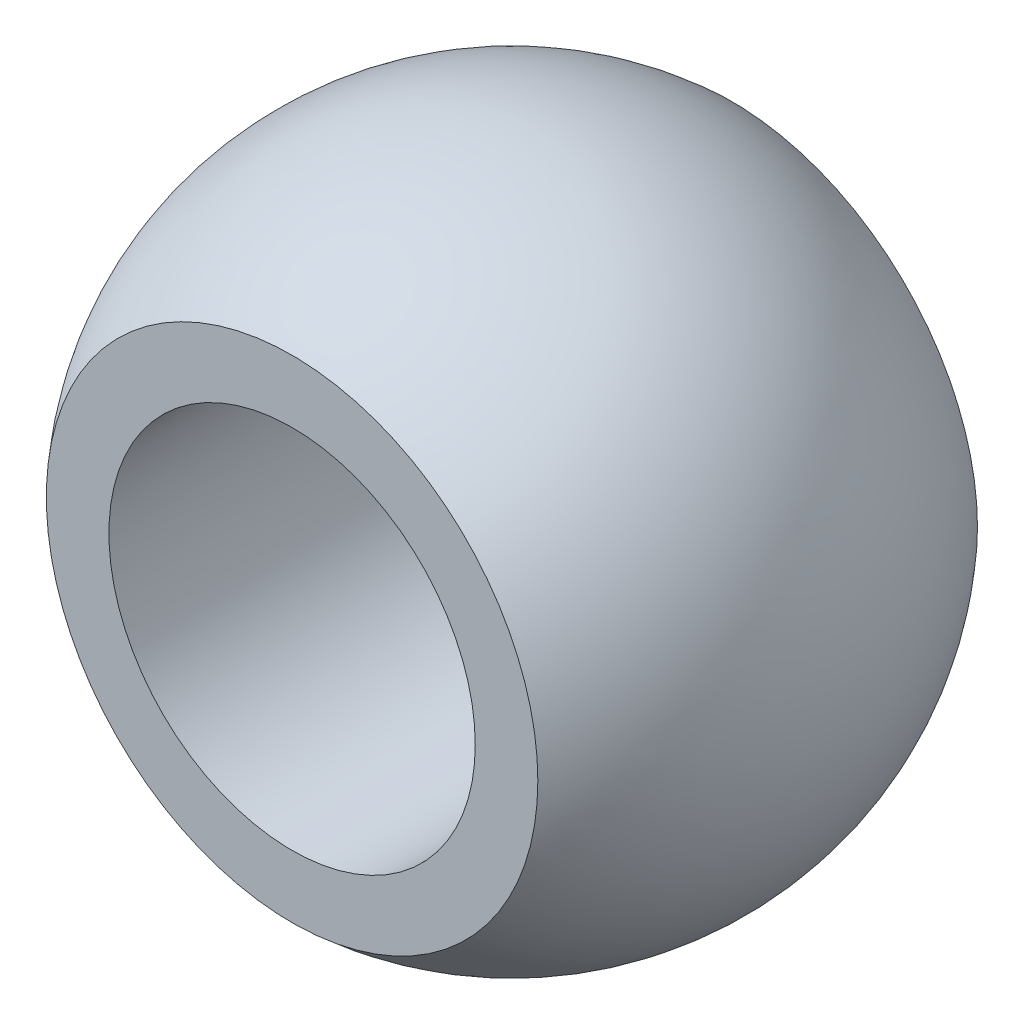
ISO-10303-21;
HEADER;
FILE_DESCRIPTION(('STEP AP214'),'2;1');
FILE_NAME('part.step','',(''),(''),'','','');
FILE_SCHEMA(('AUTOMOTIVE_DESIGN { 1 0 10303 214 1 1 1 1 }'));
ENDSEC;
DATA;
#1=APPLICATION_CONTEXT('core data for automotive mechanical design processes');
#2=APPLICATION_PROTOCOL_DEFINITION('international standard','automotive_design',2000,#1);
#3=PRODUCT_CONTEXT('',#1,'mechanical');
#4=PRODUCT('Part','Part','',(#3));
#5=PRODUCT_RELATED_PRODUCT_CATEGORY('part','',(#4));
#6=PRODUCT_DEFINITION_FORMATION('','',#4);
#7=PRODUCT_DEFINITION_CONTEXT('part definition',#1,'design');
#8=PRODUCT_DEFINITION('design','',#6,#7);
#9=PRODUCT_DEFINITION_SHAPE('','',#8);
#10=(LENGTH_UNIT() NAMED_UNIT(*) SI_UNIT(.MILLI.,.METRE.));
#11=(NAMED_UNIT(*) PLANE_ANGLE_UNIT() SI_UNIT($,.RADIAN.));
#12=(NAMED_UNIT(*) SI_UNIT($,.STERADIAN.) SOLID_ANGLE_UNIT());
#13=UNCERTAINTY_MEASURE_WITH_UNIT(LENGTH_MEASURE(1.E-05),#10,'distance_accuracy_value','');
#14=(GEOMETRIC_REPRESENTATION_CONTEXT(3) GLOBAL_UNCERTAINTY_ASSIGNED_CONTEXT((#13)) GLOBAL_UNIT_ASSIGNED_CONTEXT((#10,
#11,#12)) REPRESENTATION_CONTEXT('',''));
#15=CARTESIAN_POINT('',(0.,0.,0.));
#16=DIRECTION('',(0.,0.,1.));
#17=DIRECTION('',(1.,0.,0.));
#18=AXIS2_PLACEMENT_3D('',#15,#16,#17);
#19=CARTESIAN_POINT('',(0.,0.,0.));
#20=DIRECTION('',(0.,-1.,0.));
#21=DIRECTION('',(-1.,0.,0.));
#22=AXIS2_PLACEMENT_3D('',#19,#20,#21);
#23=SPHERICAL_SURFACE('',#22,14.2875);
#24=CARTESIAN_POINT('',(0.,0.,0.));
#25=DIRECTION('',(0.,0.,1.));
#26=DIRECTION('',(1.,0.,0.));
#27=AXIS2_PLACEMENT_3D('',#24,#25,#26);
#28=SPHERICAL_SURFACE('',#27,14.2875);
#29=CARTESIAN_POINT('',(0.,0.,9.525));
#30=DIRECTION('',(0.,0.,1.));
#31=DIRECTION('',(1.,0.,0.));
#32=AXIS2_PLACEMENT_3D('',#29,#30,#31);
#33=CIRCLE('',#32,10.6492737428427);
#34=CARTESIAN_POINT('',(10.6492737428427,0.,9.525));
#35=VERTEX_POINT('',#34);
#36=EDGE_CURVE('E10',#35,#35,#33,.T.);
#37=ORIENTED_EDGE('',*,*,#36,.F.);
#38=EDGE_LOOP('',(#37));
#39=FACE_BOUND('',#38,.T.);
#40=CARTESIAN_POINT('',(0.,0.,-9.525));
#41=DIRECTION('',(0.,0.,-1.));
#42=DIRECTION('',(-1.,0.,0.));
#43=AXIS2_PLACEMENT_3D('',#40,#41,#42);
#44=CIRCLE('',#43,10.6492737428427);
#45=CARTESIAN_POINT('',(-10.6492737428427,0.,-9.525));
#46=VERTEX_POINT('',#45);
#47=EDGE_CURVE('E38',#46,#46,#44,.T.);
#48=ORIENTED_EDGE('',*,*,#47,.F.);
#49=EDGE_LOOP('',(#48));
#50=FACE_BOUND('',#49,.T.);
#51=ADVANCED_FACE('F28',(#39,#50),#28,.T.);
#52=CARTESIAN_POINT('',(0.,0.,-25.4));
#53=DIRECTION('',(0.,0.,1.));
#54=DIRECTION('',(1.,0.,0.));
#55=AXIS2_PLACEMENT_3D('',#52,#53,#54);
#56=CYLINDRICAL_SURFACE('',#55,7.9375);
#57=CARTESIAN_POINT('',(0.,0.,9.525));
#58=DIRECTION('',(0.,0.,1.));
#59=DIRECTION('',(1.,0.,0.));
#60=AXIS2_PLACEMENT_3D('',#57,#58,#59);
#61=CIRCLE('',#60,7.9375);
#62=CARTESIAN_POINT('',(7.9375,0.,9.525));
#63=VERTEX_POINT('',#62);
#64=EDGE_CURVE('E34',#63,#63,#61,.T.);
#65=ORIENTED_EDGE('',*,*,#64,.T.);
#66=EDGE_LOOP('',(#65));
#67=FACE_BOUND('',#66,.T.);
#68=CARTESIAN_POINT('',(0.,0.,-9.525));
#69=DIRECTION('',(0.,0.,-1.));
#70=DIRECTION('',(-1.,0.,0.));
#71=AXIS2_PLACEMENT_3D('',#68,#69,#70);
#72=CIRCLE('',#71,7.9375);
#73=CARTESIAN_POINT('',(-7.9375,0.,-9.525));
#74=VERTEX_POINT('',#73);
#75=EDGE_CURVE('E42',#74,#74,#72,.T.);
#76=ORIENTED_EDGE('',*,*,#75,.T.);
#77=EDGE_LOOP('',(#76));
#78=FACE_BOUND('',#77,.T.);
#79=ADVANCED_FACE('F48',(#67,#78),#56,.F.);
#80=CARTESIAN_POINT('',(0.,0.,9.525));
#81=DIRECTION('',(0.,0.,1.));
#82=DIRECTION('',(1.,0.,0.));
#83=AXIS2_PLACEMENT_3D('',#80,#81,#82);
#84=PLANE('',#83);
#85=ORIENTED_EDGE('',*,*,#36,.T.);
#86=EDGE_LOOP('',(#85));
#87=FACE_BOUND('',#86,.T.);
#88=ORIENTED_EDGE('',*,*,#64,.F.);
#89=EDGE_LOOP('',(#88));
#90=FACE_BOUND('',#89,.T.);
#91=ADVANCED_FACE('F52',(#87,#90),#84,.T.);
#92=CARTESIAN_POINT('',(0.,0.,-9.525));
#93=DIRECTION('',(0.,0.,-1.));
#94=DIRECTION('',(1.,0.,0.));
#95=AXIS2_PLACEMENT_3D('',#92,#93,#94);
#96=PLANE('',#95);
#97=ORIENTED_EDGE('',*,*,#47,.T.);
#98=EDGE_LOOP('',(#97));
#99=FACE_BOUND('',#98,.T.);
#100=ORIENTED_EDGE('',*,*,#75,.F.);
#101=EDGE_LOOP('',(#100));
#102=FACE_BOUND('',#101,.T.);
#103=ADVANCED_FACE('F50',(#99,#102),#96,.T.);
#104=CLOSED_SHELL('',(#51,#79,#91,#103));
#105=MANIFOLD_SOLID_BREP('B2',#104);
#106=ADVANCED_BREP_SHAPE_REPRESENTATION('',(#18,#105),#14);
#107=SHAPE_DEFINITION_REPRESENTATION(#9,#106);
ENDSEC;
END-ISO-10303-21;
